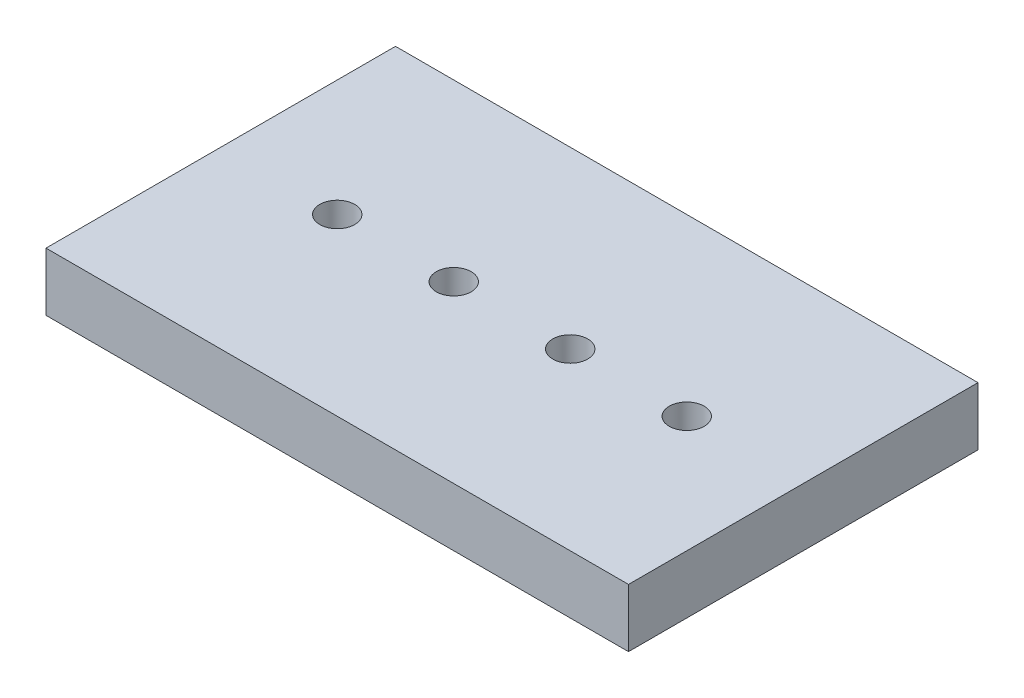
ISO-10303-21;
HEADER;
FILE_DESCRIPTION(('STEP AP214'),'2;1');
FILE_NAME('part.step','',(''),(''),'','','');
FILE_SCHEMA(('AUTOMOTIVE_DESIGN { 1 0 10303 214 1 1 1 1 }'));
ENDSEC;
DATA;
#1=APPLICATION_CONTEXT('core data for automotive mechanical design processes');
#2=APPLICATION_PROTOCOL_DEFINITION('international standard','automotive_design',2000,#1);
#3=PRODUCT_CONTEXT('',#1,'mechanical');
#4=PRODUCT('Part','Part','',(#3));
#5=PRODUCT_RELATED_PRODUCT_CATEGORY('part','',(#4));
#6=PRODUCT_DEFINITION_FORMATION('','',#4);
#7=PRODUCT_DEFINITION_CONTEXT('part definition',#1,'design');
#8=PRODUCT_DEFINITION('design','',#6,#7);
#9=PRODUCT_DEFINITION_SHAPE('','',#8);
#10=(LENGTH_UNIT() NAMED_UNIT(*) SI_UNIT(.MILLI.,.METRE.));
#11=(NAMED_UNIT(*) PLANE_ANGLE_UNIT() SI_UNIT($,.RADIAN.));
#12=(NAMED_UNIT(*) SI_UNIT($,.STERADIAN.) SOLID_ANGLE_UNIT());
#13=UNCERTAINTY_MEASURE_WITH_UNIT(LENGTH_MEASURE(1.E-05),#10,'distance_accuracy_value','');
#14=(GEOMETRIC_REPRESENTATION_CONTEXT(3) GLOBAL_UNCERTAINTY_ASSIGNED_CONTEXT((#13)) GLOBAL_UNIT_ASSIGNED_CONTEXT((#10,
#11,#12)) REPRESENTATION_CONTEXT('',''));
#15=CARTESIAN_POINT('',(0.,0.,0.));
#16=DIRECTION('',(0.,0.,1.));
#17=DIRECTION('',(1.,0.,0.));
#18=AXIS2_PLACEMENT_3D('',#15,#16,#17);
#19=CARTESIAN_POINT('',(30.,20.,0.));
#20=DIRECTION('',(0.,-1.,0.));
#21=DIRECTION('',(0.,0.,-1.));
#22=AXIS2_PLACEMENT_3D('',#19,#20,#21);
#23=CYLINDRICAL_SURFACE('',#22,3.);
#24=CARTESIAN_POINT('',(30.,0.,0.));
#25=DIRECTION('',(0.,1.,0.));
#26=DIRECTION('',(0.,0.,1.));
#27=AXIS2_PLACEMENT_3D('',#24,#25,#26);
#28=CIRCLE('',#27,3.);
#29=CARTESIAN_POINT('',(30.,0.,3.));
#30=VERTEX_POINT('',#29);
#31=EDGE_CURVE('E47',#30,#30,#28,.T.);
#32=ORIENTED_EDGE('',*,*,#31,.F.);
#33=EDGE_LOOP('',(#32));
#34=FACE_BOUND('',#33,.T.);
#35=CARTESIAN_POINT('',(30.,10.,0.));
#36=DIRECTION('',(0.,-1.,0.));
#37=DIRECTION('',(0.,0.,-1.));
#38=AXIS2_PLACEMENT_3D('',#35,#36,#37);
#39=CIRCLE('',#38,3.);
#40=CARTESIAN_POINT('',(30.,10.,-3.));
#41=VERTEX_POINT('',#40);
#42=EDGE_CURVE('E11',#41,#41,#39,.F.);
#43=ORIENTED_EDGE('',*,*,#42,.T.);
#44=EDGE_LOOP('',(#43));
#45=FACE_BOUND('',#44,.T.);
#46=ADVANCED_FACE('F39',(#34,#45),#23,.F.);
#47=CARTESIAN_POINT('',(10.,20.,0.));
#48=DIRECTION('',(0.,-1.,0.));
#49=DIRECTION('',(0.,0.,-1.));
#50=AXIS2_PLACEMENT_3D('',#47,#48,#49);
#51=CYLINDRICAL_SURFACE('',#50,3.);
#52=CARTESIAN_POINT('',(10.,0.,0.));
#53=DIRECTION('',(0.,1.,0.));
#54=DIRECTION('',(0.,0.,1.));
#55=AXIS2_PLACEMENT_3D('',#52,#53,#54);
#56=CIRCLE('',#55,3.);
#57=CARTESIAN_POINT('',(10.,0.,3.));
#58=VERTEX_POINT('',#57);
#59=EDGE_CURVE('E117',#58,#58,#56,.T.);
#60=ORIENTED_EDGE('',*,*,#59,.F.);
#61=EDGE_LOOP('',(#60));
#62=FACE_BOUND('',#61,.T.);
#63=CARTESIAN_POINT('',(10.,10.,0.));
#64=DIRECTION('',(0.,-1.,0.));
#65=DIRECTION('',(0.,0.,-1.));
#66=AXIS2_PLACEMENT_3D('',#63,#64,#65);
#67=CIRCLE('',#66,3.);
#68=CARTESIAN_POINT('',(10.,10.,-3.));
#69=VERTEX_POINT('',#68);
#70=EDGE_CURVE('E120',#69,#69,#67,.F.);
#71=ORIENTED_EDGE('',*,*,#70,.T.);
#72=EDGE_LOOP('',(#71));
#73=FACE_BOUND('',#72,.T.);
#74=ADVANCED_FACE('F129',(#62,#73),#51,.F.);
#75=CARTESIAN_POINT('',(50.,10.,30.));
#76=DIRECTION('',(-1.,0.,0.));
#77=DIRECTION('',(0.,0.,1.));
#78=AXIS2_PLACEMENT_3D('',#75,#76,#77);
#79=PLANE('',#78);
#80=DIRECTION('',(0.,0.,-1.));
#81=VECTOR('',#80,1.);
#82=CARTESIAN_POINT('',(50.,0.,30.));
#83=LINE('',#82,#81);
#84=CARTESIAN_POINT('',(50.,0.,30.));
#85=VERTEX_POINT('',#84);
#86=CARTESIAN_POINT('',(50.,0.,-30.));
#87=VERTEX_POINT('',#86);
#88=EDGE_CURVE('E107',#85,#87,#83,.T.);
#89=ORIENTED_EDGE('',*,*,#88,.T.);
#90=DIRECTION('',(0.,-1.,0.));
#91=VECTOR('',#90,1.);
#92=CARTESIAN_POINT('',(50.,10.,-30.));
#93=LINE('',#92,#91);
#94=CARTESIAN_POINT('',(50.,10.,-30.));
#95=VERTEX_POINT('',#94);
#96=EDGE_CURVE('E98',#95,#87,#93,.T.);
#97=ORIENTED_EDGE('',*,*,#96,.F.);
#98=DIRECTION('',(0.,0.,-1.));
#99=VECTOR('',#98,1.);
#100=CARTESIAN_POINT('',(50.,10.,30.));
#101=LINE('',#100,#99);
#102=CARTESIAN_POINT('',(50.,10.,30.));
#103=VERTEX_POINT('',#102);
#104=EDGE_CURVE('E92',#103,#95,#101,.T.);
#105=ORIENTED_EDGE('',*,*,#104,.F.);
#106=DIRECTION('',(0.,-1.,0.));
#107=VECTOR('',#106,1.);
#108=CARTESIAN_POINT('',(50.,10.,30.));
#109=LINE('',#108,#107);
#110=EDGE_CURVE('E103',#103,#85,#109,.T.);
#111=ORIENTED_EDGE('',*,*,#110,.T.);
#112=EDGE_LOOP('',(#89,#97,#105,#111));
#113=FACE_BOUND('',#112,.T.);
#114=ADVANCED_FACE('F153',(#113),#79,.F.);
#115=CARTESIAN_POINT('',(-50.,10.,-30.));
#116=DIRECTION('',(0.,0.,1.));
#117=DIRECTION('',(1.,0.,0.));
#118=AXIS2_PLACEMENT_3D('',#115,#116,#117);
#119=PLANE('',#118);
#120=DIRECTION('',(-1.,0.,0.));
#121=VECTOR('',#120,1.);
#122=CARTESIAN_POINT('',(-50.,0.,-30.));
#123=LINE('',#122,#121);
#124=CARTESIAN_POINT('',(-50.,0.,-30.));
#125=VERTEX_POINT('',#124);
#126=EDGE_CURVE('E97',#87,#125,#123,.T.);
#127=ORIENTED_EDGE('',*,*,#126,.T.);
#128=DIRECTION('',(0.,-1.,0.));
#129=VECTOR('',#128,1.);
#130=CARTESIAN_POINT('',(-50.,10.,-30.));
#131=LINE('',#130,#129);
#132=CARTESIAN_POINT('',(-50.,10.,-30.));
#133=VERTEX_POINT('',#132);
#134=EDGE_CURVE('E95',#133,#125,#131,.T.);
#135=ORIENTED_EDGE('',*,*,#134,.F.);
#136=DIRECTION('',(-1.,0.,0.));
#137=VECTOR('',#136,1.);
#138=CARTESIAN_POINT('',(-50.,10.,-30.));
#139=LINE('',#138,#137);
#140=EDGE_CURVE('E86',#95,#133,#139,.T.);
#141=ORIENTED_EDGE('',*,*,#140,.F.);
#142=ORIENTED_EDGE('',*,*,#96,.T.);
#143=EDGE_LOOP('',(#127,#135,#141,#142));
#144=FACE_BOUND('',#143,.T.);
#145=ADVANCED_FACE('F96',(#144),#119,.F.);
#146=CARTESIAN_POINT('',(-50.,10.,30.));
#147=DIRECTION('',(1.,0.,0.));
#148=DIRECTION('',(0.,0.,-1.));
#149=AXIS2_PLACEMENT_3D('',#146,#147,#148);
#150=PLANE('',#149);
#151=DIRECTION('',(0.,0.,1.));
#152=VECTOR('',#151,1.);
#153=CARTESIAN_POINT('',(-50.,0.,30.));
#154=LINE('',#153,#152);
#155=CARTESIAN_POINT('',(-50.,0.,30.));
#156=VERTEX_POINT('',#155);
#157=EDGE_CURVE('E72',#125,#156,#154,.T.);
#158=ORIENTED_EDGE('',*,*,#157,.T.);
#159=DIRECTION('',(0.,-1.,0.));
#160=VECTOR('',#159,1.);
#161=CARTESIAN_POINT('',(-50.,10.,30.));
#162=LINE('',#161,#160);
#163=CARTESIAN_POINT('',(-50.,10.,30.));
#164=VERTEX_POINT('',#163);
#165=EDGE_CURVE('E99',#164,#156,#162,.T.);
#166=ORIENTED_EDGE('',*,*,#165,.F.);
#167=DIRECTION('',(0.,0.,1.));
#168=VECTOR('',#167,1.);
#169=CARTESIAN_POINT('',(-50.,10.,30.));
#170=LINE('',#169,#168);
#171=EDGE_CURVE('E90',#133,#164,#170,.T.);
#172=ORIENTED_EDGE('',*,*,#171,.F.);
#173=ORIENTED_EDGE('',*,*,#134,.T.);
#174=EDGE_LOOP('',(#158,#166,#172,#173));
#175=FACE_BOUND('',#174,.T.);
#176=ADVANCED_FACE('F101',(#175),#150,.F.);
#177=CARTESIAN_POINT('',(-50.,10.,30.));
#178=DIRECTION('',(0.,0.,-1.));
#179=DIRECTION('',(-1.,0.,0.));
#180=AXIS2_PLACEMENT_3D('',#177,#178,#179);
#181=PLANE('',#180);
#182=DIRECTION('',(1.,0.,0.));
#183=VECTOR('',#182,1.);
#184=CARTESIAN_POINT('',(-50.,0.,30.));
#185=LINE('',#184,#183);
#186=EDGE_CURVE('E78',#156,#85,#185,.T.);
#187=ORIENTED_EDGE('',*,*,#186,.T.);
#188=ORIENTED_EDGE('',*,*,#110,.F.);
#189=DIRECTION('',(1.,0.,0.));
#190=VECTOR('',#189,1.);
#191=CARTESIAN_POINT('',(-50.,10.,30.));
#192=LINE('',#191,#190);
#193=EDGE_CURVE('E55',#164,#103,#192,.T.);
#194=ORIENTED_EDGE('',*,*,#193,.F.);
#195=ORIENTED_EDGE('',*,*,#165,.T.);
#196=EDGE_LOOP('',(#187,#188,#194,#195));
#197=FACE_BOUND('',#196,.T.);
#198=ADVANCED_FACE('F133',(#197),#181,.F.);
#199=CARTESIAN_POINT('',(0.,10.,0.));
#200=DIRECTION('',(0.,-1.,0.));
#201=DIRECTION('',(0.,0.,-1.));
#202=AXIS2_PLACEMENT_3D('',#199,#200,#201);
#203=PLANE('',#202);
#204=CARTESIAN_POINT('',(-10.,10.,0.));
#205=DIRECTION('',(0.,-1.,0.));
#206=DIRECTION('',(0.,0.,-1.));
#207=AXIS2_PLACEMENT_3D('',#204,#205,#206);
#208=CIRCLE('',#207,3.);
#209=CARTESIAN_POINT('',(-10.,10.,-3.));
#210=VERTEX_POINT('',#209);
#211=EDGE_CURVE('E250',#210,#210,#208,.F.);
#212=ORIENTED_EDGE('',*,*,#211,.F.);
#213=EDGE_LOOP('',(#212));
#214=FACE_BOUND('',#213,.T.);
#215=CARTESIAN_POINT('',(-30.,10.,0.));
#216=DIRECTION('',(0.,-1.,0.));
#217=DIRECTION('',(0.,0.,-1.));
#218=AXIS2_PLACEMENT_3D('',#215,#216,#217);
#219=CIRCLE('',#218,3.);
#220=CARTESIAN_POINT('',(-30.,10.,-3.));
#221=VERTEX_POINT('',#220);
#222=EDGE_CURVE('E110',#221,#221,#219,.F.);
#223=ORIENTED_EDGE('',*,*,#222,.F.);
#224=EDGE_LOOP('',(#223));
#225=FACE_BOUND('',#224,.T.);
#226=ORIENTED_EDGE('',*,*,#104,.T.);
#227=ORIENTED_EDGE('',*,*,#140,.T.);
#228=ORIENTED_EDGE('',*,*,#171,.T.);
#229=ORIENTED_EDGE('',*,*,#193,.T.);
#230=EDGE_LOOP('',(#226,#227,#228,#229));
#231=FACE_BOUND('',#230,.T.);
#232=ORIENTED_EDGE('',*,*,#70,.F.);
#233=EDGE_LOOP('',(#232));
#234=FACE_BOUND('',#233,.T.);
#235=ORIENTED_EDGE('',*,*,#42,.F.);
#236=EDGE_LOOP('',(#235));
#237=FACE_BOUND('',#236,.T.);
#238=ADVANCED_FACE('F87',(#214,#225,#231,#234,#237),#203,.F.);
#239=CARTESIAN_POINT('',(0.,0.,0.));
#240=DIRECTION('',(0.,-1.,0.));
#241=DIRECTION('',(0.,0.,-1.));
#242=AXIS2_PLACEMENT_3D('',#239,#240,#241);
#243=PLANE('',#242);
#244=CARTESIAN_POINT('',(-10.,0.,0.));
#245=DIRECTION('',(0.,1.,0.));
#246=DIRECTION('',(0.,0.,1.));
#247=AXIS2_PLACEMENT_3D('',#244,#245,#246);
#248=CIRCLE('',#247,3.);
#249=CARTESIAN_POINT('',(-10.,0.,3.));
#250=VERTEX_POINT('',#249);
#251=EDGE_CURVE('E248',#250,#250,#248,.T.);
#252=ORIENTED_EDGE('',*,*,#251,.T.);
#253=EDGE_LOOP('',(#252));
#254=FACE_BOUND('',#253,.T.);
#255=CARTESIAN_POINT('',(-30.,0.,0.));
#256=DIRECTION('',(0.,1.,0.));
#257=DIRECTION('',(0.,0.,1.));
#258=AXIS2_PLACEMENT_3D('',#255,#256,#257);
#259=CIRCLE('',#258,3.);
#260=CARTESIAN_POINT('',(-30.,0.,3.));
#261=VERTEX_POINT('',#260);
#262=EDGE_CURVE('E251',#261,#261,#259,.T.);
#263=ORIENTED_EDGE('',*,*,#262,.T.);
#264=EDGE_LOOP('',(#263));
#265=FACE_BOUND('',#264,.T.);
#266=ORIENTED_EDGE('',*,*,#88,.F.);
#267=ORIENTED_EDGE('',*,*,#186,.F.);
#268=ORIENTED_EDGE('',*,*,#157,.F.);
#269=ORIENTED_EDGE('',*,*,#126,.F.);
#270=EDGE_LOOP('',(#266,#267,#268,#269));
#271=FACE_BOUND('',#270,.T.);
#272=ORIENTED_EDGE('',*,*,#59,.T.);
#273=EDGE_LOOP('',(#272));
#274=FACE_BOUND('',#273,.T.);
#275=ORIENTED_EDGE('',*,*,#31,.T.);
#276=EDGE_LOOP('',(#275));
#277=FACE_BOUND('',#276,.T.);
#278=ADVANCED_FACE('F125',(#254,#265,#271,#274,#277),#243,.T.);
#279=CARTESIAN_POINT('',(-30.,20.,0.));
#280=DIRECTION('',(0.,-1.,0.));
#281=DIRECTION('',(0.,0.,-1.));
#282=AXIS2_PLACEMENT_3D('',#279,#280,#281);
#283=CYLINDRICAL_SURFACE('',#282,3.);
#284=ORIENTED_EDGE('',*,*,#262,.F.);
#285=EDGE_LOOP('',(#284));
#286=FACE_BOUND('',#285,.T.);
#287=ORIENTED_EDGE('',*,*,#222,.T.);
#288=EDGE_LOOP('',(#287));
#289=FACE_BOUND('',#288,.T.);
#290=ADVANCED_FACE('F140',(#286,#289),#283,.F.);
#291=CARTESIAN_POINT('',(-10.,20.,0.));
#292=DIRECTION('',(0.,-1.,0.));
#293=DIRECTION('',(0.,0.,-1.));
#294=AXIS2_PLACEMENT_3D('',#291,#292,#293);
#295=CYLINDRICAL_SURFACE('',#294,3.);
#296=ORIENTED_EDGE('',*,*,#251,.F.);
#297=EDGE_LOOP('',(#296));
#298=FACE_BOUND('',#297,.T.);
#299=ORIENTED_EDGE('',*,*,#211,.T.);
#300=EDGE_LOOP('',(#299));
#301=FACE_BOUND('',#300,.T.);
#302=ADVANCED_FACE('F192',(#298,#301),#295,.F.);
#303=CLOSED_SHELL('',(#46,#74,#114,#145,#176,#198,#238,#278,#290,#302));
#304=MANIFOLD_SOLID_BREP('B2',#303);
#305=ADVANCED_BREP_SHAPE_REPRESENTATION('',(#18,#304),#14);
#306=SHAPE_DEFINITION_REPRESENTATION(#9,#305);
ENDSEC;
END-ISO-10303-21;
